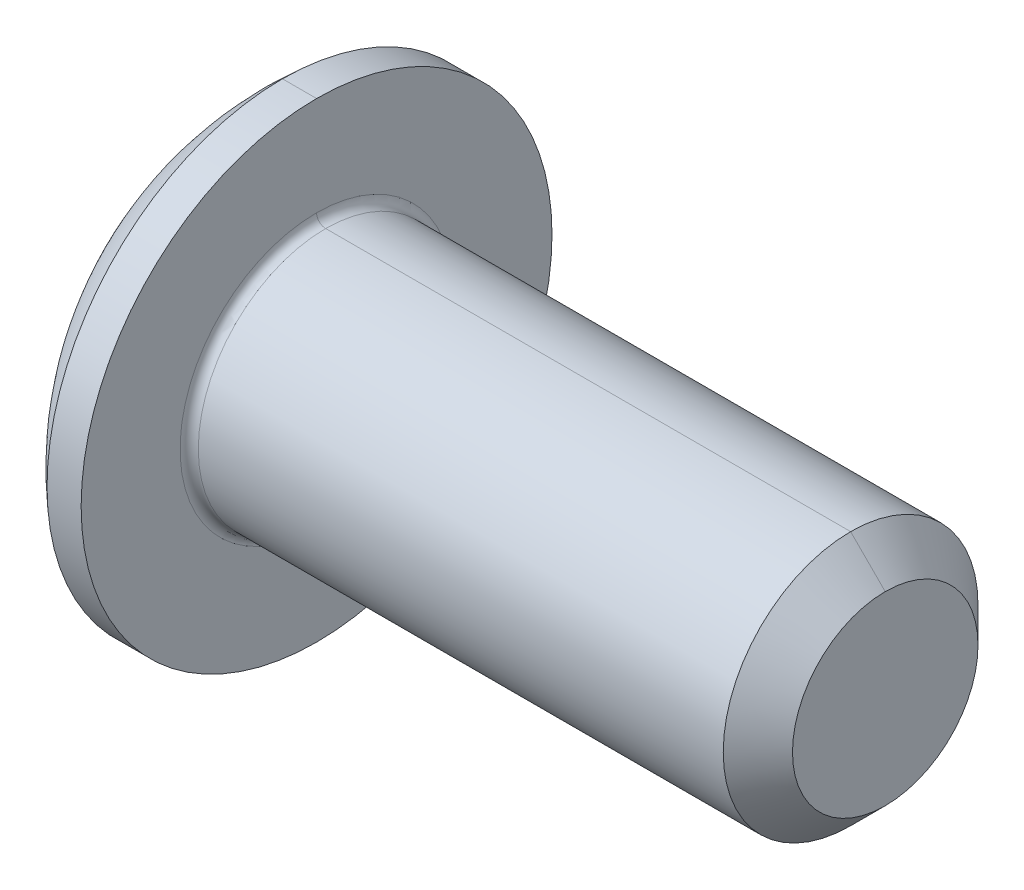
ISO-10303-21;
HEADER;
FILE_DESCRIPTION(('STEP AP214'),'2;1');
FILE_NAME('part.step','',(''),(''),'','','');
FILE_SCHEMA(('AUTOMOTIVE_DESIGN { 1 0 10303 214 1 1 1 1 }'));
ENDSEC;
DATA;
#1=APPLICATION_CONTEXT('core data for automotive mechanical design processes');
#2=APPLICATION_PROTOCOL_DEFINITION('international standard','automotive_design',2000,#1);
#3=PRODUCT_CONTEXT('',#1,'mechanical');
#4=PRODUCT('Part','Part','',(#3));
#5=PRODUCT_RELATED_PRODUCT_CATEGORY('part','',(#4));
#6=PRODUCT_DEFINITION_FORMATION('','',#4);
#7=PRODUCT_DEFINITION_CONTEXT('part definition',#1,'design');
#8=PRODUCT_DEFINITION('design','',#6,#7);
#9=PRODUCT_DEFINITION_SHAPE('','',#8);
#10=(LENGTH_UNIT() NAMED_UNIT(*) SI_UNIT(.MILLI.,.METRE.));
#11=(NAMED_UNIT(*) PLANE_ANGLE_UNIT() SI_UNIT($,.RADIAN.));
#12=(NAMED_UNIT(*) SI_UNIT($,.STERADIAN.) SOLID_ANGLE_UNIT());
#13=UNCERTAINTY_MEASURE_WITH_UNIT(LENGTH_MEASURE(1.E-05),#10,'distance_accuracy_value','');
#14=(GEOMETRIC_REPRESENTATION_CONTEXT(3) GLOBAL_UNCERTAINTY_ASSIGNED_CONTEXT((#13)) GLOBAL_UNIT_ASSIGNED_CONTEXT((#10,
#11,#12)) REPRESENTATION_CONTEXT('',''));
#15=CARTESIAN_POINT('',(0.,0.,0.));
#16=DIRECTION('',(0.,0.,1.));
#17=DIRECTION('',(1.,0.,0.));
#18=AXIS2_PLACEMENT_3D('',#15,#16,#17);
#19=CARTESIAN_POINT('',(-0.3175,0.,0.));
#20=DIRECTION('',(1.,0.,0.));
#21=DIRECTION('',(0.,-1.,0.));
#22=AXIS2_PLACEMENT_3D('',#19,#20,#21);
#23=CYLINDRICAL_SURFACE('',#22,1.4224);
#24=DIRECTION('',(1.,0.,0.));
#25=VECTOR('',#24,1.);
#26=CARTESIAN_POINT('',(0.1016,1.4224,0.));
#27=LINE('',#26,#25);
#28=CARTESIAN_POINT('',(0.1016,1.4224,0.));
#29=VERTEX_POINT('',#28);
#30=CARTESIAN_POINT('',(5.963333186975,1.4224,0.));
#31=VERTEX_POINT('',#30);
#32=EDGE_CURVE('E163',#29,#31,#27,.T.);
#33=ORIENTED_EDGE('',*,*,#32,.T.);
#34=CARTESIAN_POINT('',(5.963333186975,0.,0.));
#35=DIRECTION('',(-1.,0.,0.));
#36=DIRECTION('',(0.,1.,0.));
#37=AXIS2_PLACEMENT_3D('',#34,#35,#36);
#38=CIRCLE('',#37,1.4224);
#39=CARTESIAN_POINT('',(5.963333186975,-1.4224,0.));
#40=VERTEX_POINT('',#39);
#41=EDGE_CURVE('E134',#31,#40,#38,.T.);
#42=ORIENTED_EDGE('',*,*,#41,.T.);
#43=DIRECTION('',(1.,0.,0.));
#44=VECTOR('',#43,1.);
#45=CARTESIAN_POINT('',(0.1016,-1.4224,0.));
#46=LINE('',#45,#44);
#47=CARTESIAN_POINT('',(0.1016,-1.4224,0.));
#48=VERTEX_POINT('',#47);
#49=EDGE_CURVE('E23',#48,#40,#46,.T.);
#50=ORIENTED_EDGE('',*,*,#49,.F.);
#51=CARTESIAN_POINT('',(0.1016,0.,0.));
#52=DIRECTION('',(1.,0.,0.));
#53=DIRECTION('',(0.,-1.,0.));
#54=AXIS2_PLACEMENT_3D('',#51,#52,#53);
#55=CIRCLE('',#54,1.4224);
#56=EDGE_CURVE('E12',#48,#29,#55,.T.);
#57=ORIENTED_EDGE('',*,*,#56,.T.);
#58=EDGE_LOOP('',(#33,#42,#50,#57));
#59=FACE_BOUND('',#58,.T.);
#60=ADVANCED_FACE('F20',(#59),#23,.T.);
#61=CARTESIAN_POINT('',(0.1016,0.,0.));
#62=DIRECTION('',(1.,0.,0.));
#63=DIRECTION('',(0.,-1.,0.));
#64=AXIS2_PLACEMENT_3D('',#61,#62,#63);
#65=TOROIDAL_SURFACE('',#64,1.524,0.1016);
#66=CARTESIAN_POINT('',(0.1016,1.524,0.));
#67=DIRECTION('',(0.,0.,1.));
#68=DIRECTION('',(-1.,0.,0.));
#69=AXIS2_PLACEMENT_3D('',#66,#67,#68);
#70=CIRCLE('',#69,0.1016);
#71=CARTESIAN_POINT('',(0.,1.524,0.));
#72=VERTEX_POINT('',#71);
#73=EDGE_CURVE('E196',#72,#29,#70,.T.);
#74=ORIENTED_EDGE('',*,*,#73,.T.);
#75=ORIENTED_EDGE('',*,*,#56,.F.);
#76=CARTESIAN_POINT('',(0.1016,-1.524,0.));
#77=DIRECTION('',(0.,0.,-1.));
#78=DIRECTION('',(-1.,0.,0.));
#79=AXIS2_PLACEMENT_3D('',#76,#77,#78);
#80=CIRCLE('',#79,0.1016);
#81=CARTESIAN_POINT('',(0.,-1.524,0.));
#82=VERTEX_POINT('',#81);
#83=EDGE_CURVE('E200',#82,#48,#80,.T.);
#84=ORIENTED_EDGE('',*,*,#83,.F.);
#85=CARTESIAN_POINT('',(0.,0.,0.));
#86=DIRECTION('',(1.,0.,0.));
#87=DIRECTION('',(0.,-1.,0.));
#88=AXIS2_PLACEMENT_3D('',#85,#86,#87);
#89=CIRCLE('',#88,1.524);
#90=EDGE_CURVE('E228',#82,#72,#89,.T.);
#91=ORIENTED_EDGE('',*,*,#90,.T.);
#92=EDGE_LOOP('',(#74,#75,#84,#91));
#93=FACE_BOUND('',#92,.T.);
#94=ADVANCED_FACE('F354',(#93),#65,.F.);
#95=CARTESIAN_POINT('',(-1.397,0.454605601959952,-0.7874));
#96=DIRECTION('',(0.,-0.866025403784429,0.500000000000017));
#97=DIRECTION('',(0.,0.500000000000017,0.866025403784429));
#98=AXIS2_PLACEMENT_3D('',#95,#96,#97);
#99=PLANE('',#98);
#100=DIRECTION('',(-1.,0.,0.));
#101=VECTOR('',#100,1.);
#102=CARTESIAN_POINT('',(-0.508000244750286,0.909211203919889,0.));
#103=LINE('',#102,#101);
#104=CARTESIAN_POINT('',(-0.508000244750276,0.909211203919896,0.));
#105=VERTEX_POINT('',#104);
#106=CARTESIAN_POINT('',(-1.397,0.909211203919887,0.));
#107=VERTEX_POINT('',#106);
#108=EDGE_CURVE('E281',#105,#107,#103,.T.);
#109=ORIENTED_EDGE('',*,*,#108,.T.);
#110=DIRECTION('',(0.,-0.500000000000017,-0.866025403784429));
#111=VECTOR('',#110,1.);
#112=CARTESIAN_POINT('',(-1.397,0.909211203919884,0.));
#113=LINE('',#112,#111);
#114=CARTESIAN_POINT('',(-1.397,0.454605601959952,-0.7874));
#115=VERTEX_POINT('',#114);
#116=EDGE_CURVE('E326',#107,#115,#113,.T.);
#117=ORIENTED_EDGE('',*,*,#116,.T.);
#118=DIRECTION('',(-1.,0.,0.));
#119=VECTOR('',#118,1.);
#120=CARTESIAN_POINT('',(-0.508000244750286,0.454605601959952,-0.7874));
#121=LINE('',#120,#119);
#122=CARTESIAN_POINT('',(-0.508000244750277,0.454605601959955,-0.787400000000009));
#123=VERTEX_POINT('',#122);
#124=EDGE_CURVE('E30',#123,#115,#121,.T.);
#125=ORIENTED_EDGE('',*,*,#124,.F.);
#126=CARTESIAN_POINT('',(-2.08279926574925,0.681908402939897,-0.393700000000035));
#127=DIRECTION('',(0.,-0.866025403784429,0.500000000000017));
#128=DIRECTION('',(0.960768876886009,-0.13867512863452,-0.240192368541127));
#129=AXIS2_PLACEMENT_3D('',#126,#127,#128);
#130=CIRCLE('',#129,1.63910286738593);
#131=EDGE_CURVE('E267',#123,#105,#130,.T.);
#132=ORIENTED_EDGE('',*,*,#131,.T.);
#133=EDGE_LOOP('',(#109,#117,#125,#132));
#134=FACE_BOUND('',#133,.T.);
#135=ADVANCED_FACE('F346',(#134),#99,.T.);
#136=CARTESIAN_POINT('',(-1.397,-0.454605601959952,-0.7874));
#137=DIRECTION('',(0.,0.,1.));
#138=DIRECTION('',(0.,1.,0.));
#139=AXIS2_PLACEMENT_3D('',#136,#137,#138);
#140=PLANE('',#139);
#141=ORIENTED_EDGE('',*,*,#124,.T.);
#142=DIRECTION('',(0.,-1.,0.));
#143=VECTOR('',#142,1.);
#144=CARTESIAN_POINT('',(-1.397,0.454605601959952,-0.7874));
#145=LINE('',#144,#143);
#146=CARTESIAN_POINT('',(-1.397,-0.454605601959964,-0.787400000000003));
#147=VERTEX_POINT('',#146);
#148=EDGE_CURVE('E329',#115,#147,#145,.T.);
#149=ORIENTED_EDGE('',*,*,#148,.T.);
#150=DIRECTION('',(-1.,0.,0.));
#151=VECTOR('',#150,1.);
#152=CARTESIAN_POINT('',(-0.508000244750294,-0.454605601959952,-0.7874));
#153=LINE('',#152,#151);
#154=CARTESIAN_POINT('',(-0.508000244750276,-0.454605601959966,-0.787400000000008));
#155=VERTEX_POINT('',#154);
#156=EDGE_CURVE('E43',#155,#147,#153,.T.);
#157=ORIENTED_EDGE('',*,*,#156,.F.);
#158=CARTESIAN_POINT('',(-2.08279926574925,0.,-0.7874));
#159=DIRECTION('',(0.,0.,1.));
#160=DIRECTION('',(0.960768876885996,-0.277350257269074,0.));
#161=AXIS2_PLACEMENT_3D('',#158,#159,#160);
#162=CIRCLE('',#161,1.63910286738595);
#163=EDGE_CURVE('E264',#155,#123,#162,.T.);
#164=ORIENTED_EDGE('',*,*,#163,.T.);
#165=EDGE_LOOP('',(#141,#149,#157,#164));
#166=FACE_BOUND('',#165,.T.);
#167=ADVANCED_FACE('F344',(#166),#140,.T.);
#168=CARTESIAN_POINT('',(-2.08279926574925,0.,0.));
#169=DIRECTION('',(1.,0.,0.));
#170=DIRECTION('',(0.,-1.,0.));
#171=AXIS2_PLACEMENT_3D('',#168,#169,#170);
#172=SPHERICAL_SURFACE('',#171,1.81842156);
#173=CARTESIAN_POINT('',(-2.08279926574925,0.,0.));
#174=DIRECTION('',(0.,0.,1.));
#175=DIRECTION('',(0.866025269189491,-0.500000233125215,0.));
#176=AXIS2_PLACEMENT_3D('',#173,#174,#175);
#177=CIRCLE('',#176,1.81842156);
#178=CARTESIAN_POINT('',(-0.508000244750272,-0.909211203919897,0.));
#179=VERTEX_POINT('',#178);
#180=CARTESIAN_POINT('',(-0.264377705749246,0.,0.));
#181=VERTEX_POINT('',#180);
#182=EDGE_CURVE('E272',#179,#181,#177,.T.);
#183=ORIENTED_EDGE('',*,*,#182,.T.);
#184=CARTESIAN_POINT('',(-2.08279926574925,0.,0.));
#185=DIRECTION('',(0.,0.,-1.));
#186=DIRECTION('',(0.866025269189494,0.50000023312521,0.));
#187=AXIS2_PLACEMENT_3D('',#184,#185,#186);
#188=CIRCLE('',#187,1.81842156);
#189=EDGE_CURVE('E260',#105,#181,#188,.T.);
#190=ORIENTED_EDGE('',*,*,#189,.F.);
#191=ORIENTED_EDGE('',*,*,#131,.F.);
#192=ORIENTED_EDGE('',*,*,#163,.F.);
#193=CARTESIAN_POINT('',(-2.08279926574925,-0.681908402939913,-0.393700000000044));
#194=DIRECTION('',(0.,0.866025403784429,0.500000000000017));
#195=DIRECTION('',(0.960768876885994,-0.138675128634545,0.240192368541171));
#196=AXIS2_PLACEMENT_3D('',#193,#194,#195);
#197=CIRCLE('',#196,1.63910286738592);
#198=EDGE_CURVE('E259',#179,#155,#197,.T.);
#199=ORIENTED_EDGE('',*,*,#198,.F.);
#200=EDGE_LOOP('',(#183,#190,#191,#192,#199));
#201=FACE_BOUND('',#200,.T.);
#202=ADVANCED_FACE('F342',(#201),#172,.F.);
#203=CARTESIAN_POINT('',(-1.397,-0.909211203919904,0.));
#204=DIRECTION('',(0.,0.866025403784429,0.500000000000017));
#205=DIRECTION('',(0.,0.500000000000017,-0.866025403784429));
#206=AXIS2_PLACEMENT_3D('',#203,#204,#205);
#207=PLANE('',#206);
#208=ORIENTED_EDGE('',*,*,#156,.T.);
#209=DIRECTION('',(0.,-0.500000000000017,0.866025403784429));
#210=VECTOR('',#209,1.);
#211=CARTESIAN_POINT('',(-1.397,-0.454605601959972,-0.7874));
#212=LINE('',#211,#210);
#213=CARTESIAN_POINT('',(-1.397,-0.909211203919904,0.));
#214=VERTEX_POINT('',#213);
#215=EDGE_CURVE('E333',#147,#214,#212,.T.);
#216=ORIENTED_EDGE('',*,*,#215,.T.);
#217=DIRECTION('',(-1.,0.,0.));
#218=VECTOR('',#217,1.);
#219=CARTESIAN_POINT('',(-0.508000244750286,-0.909211203919904,0.));
#220=LINE('',#219,#218);
#221=EDGE_CURVE('E255',#179,#214,#220,.T.);
#222=ORIENTED_EDGE('',*,*,#221,.F.);
#223=ORIENTED_EDGE('',*,*,#198,.T.);
#224=EDGE_LOOP('',(#208,#216,#222,#223));
#225=FACE_BOUND('',#224,.T.);
#226=ADVANCED_FACE('F340',(#225),#207,.T.);
#227=CARTESIAN_POINT('',(-1.397,-0.909211203919904,0.));
#228=DIRECTION('',(0.,0.866025403784429,-0.500000000000017));
#229=DIRECTION('',(0.,0.500000000000017,0.866025403784429));
#230=AXIS2_PLACEMENT_3D('',#227,#228,#229);
#231=PLANE('',#230);
#232=DIRECTION('',(-1.,0.,0.));
#233=VECTOR('',#232,1.);
#234=CARTESIAN_POINT('',(-0.508000244750286,-0.454605601959967,0.787400000000009));
#235=LINE('',#234,#233);
#236=CARTESIAN_POINT('',(-0.508000244750277,-0.45460560195996,0.787400000000012));
#237=VERTEX_POINT('',#236);
#238=CARTESIAN_POINT('',(-1.397,-0.454605601959964,0.787400000000003));
#239=VERTEX_POINT('',#238);
#240=EDGE_CURVE('E245',#237,#239,#235,.T.);
#241=ORIENTED_EDGE('',*,*,#240,.F.);
#242=CARTESIAN_POINT('',(-2.08279926574925,-0.681908402939913,0.393700000000044));
#243=DIRECTION('',(0.,0.866025403784429,-0.500000000000017));
#244=DIRECTION('',(0.960768876886009,0.13867512863452,0.240192368541127));
#245=AXIS2_PLACEMENT_3D('',#242,#243,#244);
#246=CIRCLE('',#245,1.63910286738592);
#247=EDGE_CURVE('E251',#237,#179,#246,.T.);
#248=ORIENTED_EDGE('',*,*,#247,.T.);
#249=ORIENTED_EDGE('',*,*,#221,.T.);
#250=DIRECTION('',(0.,0.500000000000017,0.866025403784429));
#251=VECTOR('',#250,1.);
#252=CARTESIAN_POINT('',(-1.397,-0.909211203919904,0.));
#253=LINE('',#252,#251);
#254=EDGE_CURVE('E287',#214,#239,#253,.T.);
#255=ORIENTED_EDGE('',*,*,#254,.T.);
#256=EDGE_LOOP('',(#241,#248,#249,#255));
#257=FACE_BOUND('',#256,.T.);
#258=ADVANCED_FACE('F339',(#257),#231,.T.);
#259=CARTESIAN_POINT('',(-2.08279926574925,0.,0.));
#260=DIRECTION('',(1.,0.,0.));
#261=DIRECTION('',(0.,-1.,0.));
#262=AXIS2_PLACEMENT_3D('',#259,#260,#261);
#263=SPHERICAL_SURFACE('',#262,1.81842156);
#264=CARTESIAN_POINT('',(-2.08279926574925,0.,0.7874));
#265=DIRECTION('',(0.,0.,-1.));
#266=DIRECTION('',(0.960768876885996,0.277350257269074,0.));
#267=AXIS2_PLACEMENT_3D('',#264,#265,#266);
#268=CIRCLE('',#267,1.63910286738595);
#269=CARTESIAN_POINT('',(-0.508000244750276,0.454605601959961,0.787400000000005));
#270=VERTEX_POINT('',#269);
#271=EDGE_CURVE('E252',#270,#237,#268,.T.);
#272=ORIENTED_EDGE('',*,*,#271,.F.);
#273=CARTESIAN_POINT('',(-2.08279926574925,0.681908402939897,0.393700000000035));
#274=DIRECTION('',(0.,-0.866025403784429,-0.500000000000017));
#275=DIRECTION('',(0.960768876885994,0.138675128634545,-0.240192368541171));
#276=AXIS2_PLACEMENT_3D('',#273,#274,#275);
#277=CIRCLE('',#276,1.63910286738593);
#278=EDGE_CURVE('E286',#105,#270,#277,.T.);
#279=ORIENTED_EDGE('',*,*,#278,.F.);
#280=ORIENTED_EDGE('',*,*,#189,.T.);
#281=ORIENTED_EDGE('',*,*,#182,.F.);
#282=ORIENTED_EDGE('',*,*,#247,.F.);
#283=EDGE_LOOP('',(#272,#279,#280,#281,#282));
#284=FACE_BOUND('',#283,.T.);
#285=ADVANCED_FACE('F311',(#284),#263,.F.);
#286=CARTESIAN_POINT('',(-1.397,-0.454605601959952,0.7874));
#287=DIRECTION('',(0.,0.,-1.));
#288=DIRECTION('',(0.,1.,0.));
#289=AXIS2_PLACEMENT_3D('',#286,#287,#288);
#290=PLANE('',#289);
#291=ORIENTED_EDGE('',*,*,#240,.T.);
#292=DIRECTION('',(0.,-1.,0.));
#293=VECTOR('',#292,1.);
#294=CARTESIAN_POINT('',(-1.397,0.454605601959952,0.7874));
#295=LINE('',#294,#293);
#296=CARTESIAN_POINT('',(-1.397,0.454605601959952,0.7874));
#297=VERTEX_POINT('',#296);
#298=EDGE_CURVE('E293',#297,#239,#295,.T.);
#299=ORIENTED_EDGE('',*,*,#298,.F.);
#300=DIRECTION('',(-1.,0.,0.));
#301=VECTOR('',#300,1.);
#302=CARTESIAN_POINT('',(-0.508000244750294,0.454605601959952,0.7874));
#303=LINE('',#302,#301);
#304=EDGE_CURVE('E289',#270,#297,#303,.T.);
#305=ORIENTED_EDGE('',*,*,#304,.F.);
#306=ORIENTED_EDGE('',*,*,#271,.T.);
#307=EDGE_LOOP('',(#291,#299,#305,#306));
#308=FACE_BOUND('',#307,.T.);
#309=ADVANCED_FACE('F318',(#308),#290,.T.);
#310=CARTESIAN_POINT('',(-1.397,0.454605601959952,0.7874));
#311=DIRECTION('',(0.,-0.866025403784429,-0.500000000000017));
#312=DIRECTION('',(0.,0.500000000000017,-0.866025403784429));
#313=AXIS2_PLACEMENT_3D('',#310,#311,#312);
#314=PLANE('',#313);
#315=ORIENTED_EDGE('',*,*,#108,.F.);
#316=ORIENTED_EDGE('',*,*,#278,.T.);
#317=ORIENTED_EDGE('',*,*,#304,.T.);
#318=DIRECTION('',(0.,0.500000000000017,-0.866025403784429));
#319=VECTOR('',#318,1.);
#320=CARTESIAN_POINT('',(-1.397,0.454605601959952,0.7874));
#321=LINE('',#320,#319);
#322=EDGE_CURVE('E187',#297,#107,#321,.T.);
#323=ORIENTED_EDGE('',*,*,#322,.T.);
#324=EDGE_LOOP('',(#315,#316,#317,#323));
#325=FACE_BOUND('',#324,.T.);
#326=ADVANCED_FACE('F306',(#325),#314,.T.);
#327=CARTESIAN_POINT('',(-1.397,0.,0.));
#328=DIRECTION('',(1.,0.,0.));
#329=DIRECTION('',(0.,-1.,0.));
#330=AXIS2_PLACEMENT_3D('',#327,#328,#329);
#331=PLANE('',#330);
#332=ORIENTED_EDGE('',*,*,#298,.T.);
#333=ORIENTED_EDGE('',*,*,#254,.F.);
#334=ORIENTED_EDGE('',*,*,#215,.F.);
#335=ORIENTED_EDGE('',*,*,#148,.F.);
#336=ORIENTED_EDGE('',*,*,#116,.F.);
#337=ORIENTED_EDGE('',*,*,#322,.F.);
#338=EDGE_LOOP('',(#332,#333,#334,#335,#336,#337));
#339=FACE_BOUND('',#338,.T.);
#340=CARTESIAN_POINT('',(-1.397,0.,0.));
#341=DIRECTION('',(1.,0.,0.));
#342=DIRECTION('',(0.,1.,0.));
#343=AXIS2_PLACEMENT_3D('',#340,#341,#342);
#344=CIRCLE('',#343,1.1241719325032);
#345=CARTESIAN_POINT('',(-1.39700000000065,1.12417193250022,0.));
#346=VERTEX_POINT('',#345);
#347=CARTESIAN_POINT('',(-1.39700000000065,-1.12417193250022,0.));
#348=VERTEX_POINT('',#347);
#349=EDGE_CURVE('E188',#346,#348,#344,.T.);
#350=ORIENTED_EDGE('',*,*,#349,.F.);
#351=CARTESIAN_POINT('',(-1.397,0.,0.));
#352=DIRECTION('',(1.,0.,0.));
#353=DIRECTION('',(0.,-1.,0.));
#354=AXIS2_PLACEMENT_3D('',#351,#352,#353);
#355=CIRCLE('',#354,1.1241719325032);
#356=EDGE_CURVE('E182',#348,#346,#355,.T.);
#357=ORIENTED_EDGE('',*,*,#356,.F.);
#358=EDGE_LOOP('',(#350,#357));
#359=FACE_BOUND('',#358,.T.);
#360=ADVANCED_FACE('F321',(#339,#359),#331,.F.);
#361=CARTESIAN_POINT('',(1.89020899418278,0.,0.));
#362=DIRECTION('',(-0.94619920312116,-0.323584715357325,0.));
#363=DIRECTION('',(-0.323584715357325,0.94619920312116,0.));
#364=AXIS2_PLACEMENT_3D('',#361,#362,#363);
#365=SPHERICAL_SURFACE('',#364,3.4741193855802);
#366=CARTESIAN_POINT('',(-0.380999999999999,0.,0.));
#367=DIRECTION('',(1.,0.,0.));
#368=DIRECTION('',(0.,-1.,0.));
#369=AXIS2_PLACEMENT_3D('',#366,#367,#368);
#370=CIRCLE('',#369,2.6289);
#371=CARTESIAN_POINT('',(-0.381000000000347,-2.6289000000004,0.));
#372=VERTEX_POINT('',#371);
#373=CARTESIAN_POINT('',(-0.381000000000347,2.6289000000004,0.));
#374=VERTEX_POINT('',#373);
#375=EDGE_CURVE('E171',#372,#374,#370,.T.);
#376=ORIENTED_EDGE('',*,*,#375,.F.);
#377=CARTESIAN_POINT('',(1.89020899418278,0.,0.));
#378=DIRECTION('',(0.,0.,1.));
#379=DIRECTION('',(-0.94619920312116,-0.323584715357325,0.));
#380=AXIS2_PLACEMENT_3D('',#377,#378,#379);
#381=CIRCLE('',#380,3.4741193855802);
#382=EDGE_CURVE('E179',#348,#372,#381,.T.);
#383=ORIENTED_EDGE('',*,*,#382,.F.);
#384=ORIENTED_EDGE('',*,*,#356,.T.);
#385=CARTESIAN_POINT('',(1.89020899418278,0.,0.));
#386=DIRECTION('',(0.,0.,-1.));
#387=DIRECTION('',(-0.94619920312116,0.323584715357325,0.));
#388=AXIS2_PLACEMENT_3D('',#385,#386,#387);
#389=CIRCLE('',#388,3.4741193855802);
#390=EDGE_CURVE('E222',#346,#374,#389,.T.);
#391=ORIENTED_EDGE('',*,*,#390,.T.);
#392=EDGE_LOOP('',(#376,#383,#384,#391));
#393=FACE_BOUND('',#392,.T.);
#394=ADVANCED_FACE('F395',(#393),#365,.T.);
#395=CARTESIAN_POINT('',(1.89020899418278,0.,0.));
#396=DIRECTION('',(1.,0.,0.));
#397=DIRECTION('',(0.,-1.,0.));
#398=AXIS2_PLACEMENT_3D('',#395,#396,#397);
#399=SPHERICAL_SURFACE('',#398,3.4741193855802);
#400=ORIENTED_EDGE('',*,*,#349,.T.);
#401=ORIENTED_EDGE('',*,*,#382,.T.);
#402=CARTESIAN_POINT('',(-0.381000000000694,0.,0.));
#403=DIRECTION('',(1.,0.,0.));
#404=DIRECTION('',(0.,1.,0.));
#405=AXIS2_PLACEMENT_3D('',#402,#403,#404);
#406=CIRCLE('',#405,2.6289000000008);
#407=EDGE_CURVE('E217',#374,#372,#406,.T.);
#408=ORIENTED_EDGE('',*,*,#407,.F.);
#409=ORIENTED_EDGE('',*,*,#390,.F.);
#410=EDGE_LOOP('',(#400,#401,#408,#409));
#411=FACE_BOUND('',#410,.T.);
#412=ADVANCED_FACE('F391',(#411),#399,.T.);
#413=CARTESIAN_POINT('',(-1.46685,0.,0.));
#414=DIRECTION('',(1.,0.,0.));
#415=DIRECTION('',(0.,-1.,0.));
#416=AXIS2_PLACEMENT_3D('',#413,#414,#415);
#417=CYLINDRICAL_SURFACE('',#416,2.6289);
#418=ORIENTED_EDGE('',*,*,#407,.T.);
#419=DIRECTION('',(1.,0.,0.));
#420=VECTOR('',#419,1.);
#421=CARTESIAN_POINT('',(-0.381,-2.6289,0.));
#422=LINE('',#421,#420);
#423=CARTESIAN_POINT('',(0.,-2.6289,0.));
#424=VERTEX_POINT('',#423);
#425=EDGE_CURVE('E177',#372,#424,#422,.T.);
#426=ORIENTED_EDGE('',*,*,#425,.T.);
#427=CARTESIAN_POINT('',(0.,0.,0.));
#428=DIRECTION('',(-1.,0.,0.));
#429=DIRECTION('',(0.,-1.,0.));
#430=AXIS2_PLACEMENT_3D('',#427,#428,#429);
#431=CIRCLE('',#430,2.6289);
#432=CARTESIAN_POINT('',(0.,2.6289,0.));
#433=VERTEX_POINT('',#432);
#434=EDGE_CURVE('E211',#424,#433,#431,.T.);
#435=ORIENTED_EDGE('',*,*,#434,.T.);
#436=DIRECTION('',(1.,0.,0.));
#437=VECTOR('',#436,1.);
#438=CARTESIAN_POINT('',(-0.381,2.6289,0.));
#439=LINE('',#438,#437);
#440=EDGE_CURVE('E178',#374,#433,#439,.T.);
#441=ORIENTED_EDGE('',*,*,#440,.F.);
#442=EDGE_LOOP('',(#418,#426,#435,#441));
#443=FACE_BOUND('',#442,.T.);
#444=ADVANCED_FACE('F403',(#443),#417,.T.);
#445=CARTESIAN_POINT('',(-1.46685,0.,0.));
#446=DIRECTION('',(1.,0.,0.));
#447=DIRECTION('',(0.,-1.,0.));
#448=AXIS2_PLACEMENT_3D('',#445,#446,#447);
#449=CYLINDRICAL_SURFACE('',#448,2.6289);
#450=CARTESIAN_POINT('',(0.,0.,0.));
#451=DIRECTION('',(-1.,0.,0.));
#452=DIRECTION('',(0.,1.,0.));
#453=AXIS2_PLACEMENT_3D('',#450,#451,#452);
#454=CIRCLE('',#453,2.6289);
#455=EDGE_CURVE('E206',#433,#424,#454,.T.);
#456=ORIENTED_EDGE('',*,*,#455,.T.);
#457=ORIENTED_EDGE('',*,*,#425,.F.);
#458=ORIENTED_EDGE('',*,*,#375,.T.);
#459=ORIENTED_EDGE('',*,*,#440,.T.);
#460=EDGE_LOOP('',(#456,#457,#458,#459));
#461=FACE_BOUND('',#460,.T.);
#462=ADVANCED_FACE('F398',(#461),#449,.T.);
#463=CARTESIAN_POINT('',(0.,0.,0.));
#464=DIRECTION('',(1.,0.,0.));
#465=DIRECTION('',(0.,-1.,0.));
#466=AXIS2_PLACEMENT_3D('',#463,#464,#465);
#467=PLANE('',#466);
#468=ORIENTED_EDGE('',*,*,#90,.F.);
#469=CARTESIAN_POINT('',(0.,0.,0.));
#470=DIRECTION('',(1.,0.,0.));
#471=DIRECTION('',(0.,1.,0.));
#472=AXIS2_PLACEMENT_3D('',#469,#470,#471);
#473=CIRCLE('',#472,1.524);
#474=EDGE_CURVE('E201',#72,#82,#473,.T.);
#475=ORIENTED_EDGE('',*,*,#474,.F.);
#476=EDGE_LOOP('',(#468,#475));
#477=FACE_BOUND('',#476,.T.);
#478=ORIENTED_EDGE('',*,*,#434,.F.);
#479=ORIENTED_EDGE('',*,*,#455,.F.);
#480=EDGE_LOOP('',(#478,#479));
#481=FACE_BOUND('',#480,.T.);
#482=ADVANCED_FACE('F379',(#477,#481),#467,.T.);
#483=CARTESIAN_POINT('',(0.1016,0.,0.));
#484=DIRECTION('',(1.,0.,0.));
#485=DIRECTION('',(0.,-1.,0.));
#486=AXIS2_PLACEMENT_3D('',#483,#484,#485);
#487=TOROIDAL_SURFACE('',#486,1.524,0.1016);
#488=ORIENTED_EDGE('',*,*,#83,.T.);
#489=CARTESIAN_POINT('',(0.1016,0.,0.));
#490=DIRECTION('',(1.,0.,0.));
#491=DIRECTION('',(0.,1.,0.));
#492=AXIS2_PLACEMENT_3D('',#489,#490,#491);
#493=CIRCLE('',#492,1.4224);
#494=EDGE_CURVE('E162',#29,#48,#493,.T.);
#495=ORIENTED_EDGE('',*,*,#494,.F.);
#496=ORIENTED_EDGE('',*,*,#73,.F.);
#497=ORIENTED_EDGE('',*,*,#474,.T.);
#498=EDGE_LOOP('',(#488,#495,#496,#497));
#499=FACE_BOUND('',#498,.T.);
#500=ADVANCED_FACE('F376',(#499),#487,.F.);
#501=CARTESIAN_POINT('',(-0.3175,0.,0.));
#502=DIRECTION('',(1.,0.,0.));
#503=DIRECTION('',(0.,-1.,0.));
#504=AXIS2_PLACEMENT_3D('',#501,#502,#503);
#505=CYLINDRICAL_SURFACE('',#504,1.4224);
#506=ORIENTED_EDGE('',*,*,#49,.T.);
#507=CARTESIAN_POINT('',(5.963333186975,0.,0.));
#508=DIRECTION('',(-1.,0.,0.));
#509=DIRECTION('',(0.,-1.,0.));
#510=AXIS2_PLACEMENT_3D('',#507,#508,#509);
#511=CIRCLE('',#510,1.4224);
#512=EDGE_CURVE('E154',#40,#31,#511,.T.);
#513=ORIENTED_EDGE('',*,*,#512,.T.);
#514=ORIENTED_EDGE('',*,*,#32,.F.);
#515=ORIENTED_EDGE('',*,*,#494,.T.);
#516=EDGE_LOOP('',(#506,#513,#514,#515));
#517=FACE_BOUND('',#516,.T.);
#518=ADVANCED_FACE('F367',(#517),#505,.T.);
#519=CARTESIAN_POINT('',(6.3598369158658,0.,0.));
#520=DIRECTION('',(-1.,0.,0.));
#521=DIRECTION('',(0.,1.,0.));
#522=AXIS2_PLACEMENT_3D('',#519,#520,#521);
#523=CONICAL_SURFACE('',#522,1.0258962711092,0.785398163397448);
#524=ORIENTED_EDGE('',*,*,#512,.F.);
#525=DIRECTION('',(0.707106781186548,0.707106781186547,0.));
#526=VECTOR('',#525,1.);
#527=CARTESIAN_POINT('',(5.963333186975,-1.4224,0.));
#528=LINE('',#527,#526);
#529=CARTESIAN_POINT('',(6.35,-1.035733186975,0.));
#530=VERTEX_POINT('',#529);
#531=EDGE_CURVE('E125',#40,#530,#528,.T.);
#532=ORIENTED_EDGE('',*,*,#531,.T.);
#533=CARTESIAN_POINT('',(6.35,0.,0.));
#534=DIRECTION('',(-1.,0.,0.));
#535=DIRECTION('',(0.,-1.,0.));
#536=AXIS2_PLACEMENT_3D('',#533,#534,#535);
#537=CIRCLE('',#536,1.035733186975);
#538=CARTESIAN_POINT('',(6.35,1.035733186975,0.));
#539=VERTEX_POINT('',#538);
#540=EDGE_CURVE('E118',#530,#539,#537,.T.);
#541=ORIENTED_EDGE('',*,*,#540,.T.);
#542=DIRECTION('',(0.707106781186548,-0.707106781186547,0.));
#543=VECTOR('',#542,1.);
#544=CARTESIAN_POINT('',(5.963333186975,1.4224,0.));
#545=LINE('',#544,#543);
#546=EDGE_CURVE('E122',#31,#539,#545,.T.);
#547=ORIENTED_EDGE('',*,*,#546,.F.);
#548=EDGE_LOOP('',(#524,#532,#541,#547));
#549=FACE_BOUND('',#548,.T.);
#550=ADVANCED_FACE('F121',(#549),#523,.T.);
#551=CARTESIAN_POINT('',(6.3598369158658,0.,0.));
#552=DIRECTION('',(-1.,0.,0.));
#553=DIRECTION('',(0.,1.,0.));
#554=AXIS2_PLACEMENT_3D('',#551,#552,#553);
#555=CONICAL_SURFACE('',#554,1.0258962711092,0.785398163397448);
#556=CARTESIAN_POINT('',(6.35,0.,0.));
#557=DIRECTION('',(-1.,0.,0.));
#558=DIRECTION('',(0.,1.,0.));
#559=AXIS2_PLACEMENT_3D('',#556,#557,#558);
#560=CIRCLE('',#559,1.035733186975);
#561=EDGE_CURVE('E130',#539,#530,#560,.T.);
#562=ORIENTED_EDGE('',*,*,#561,.T.);
#563=ORIENTED_EDGE('',*,*,#531,.F.);
#564=ORIENTED_EDGE('',*,*,#41,.F.);
#565=ORIENTED_EDGE('',*,*,#546,.T.);
#566=EDGE_LOOP('',(#562,#563,#564,#565));
#567=FACE_BOUND('',#566,.T.);
#568=ADVANCED_FACE('F133',(#567),#555,.T.);
#569=CARTESIAN_POINT('',(6.35,0.,0.));
#570=DIRECTION('',(1.,0.,0.));
#571=DIRECTION('',(0.,-1.,0.));
#572=AXIS2_PLACEMENT_3D('',#569,#570,#571);
#573=PLANE('',#572);
#574=ORIENTED_EDGE('',*,*,#540,.F.);
#575=ORIENTED_EDGE('',*,*,#561,.F.);
#576=EDGE_LOOP('',(#574,#575));
#577=FACE_BOUND('',#576,.T.);
#578=ADVANCED_FACE('F136',(#577),#573,.T.);
#579=CLOSED_SHELL('',(#60,#94,#135,#167,#202,#226,#258,#285,#309,#326,#360,#394,#412,#444,#462,
#482,#500,#518,#550,#568,#578));
#580=MANIFOLD_SOLID_BREP('B1',#579);
#581=ADVANCED_BREP_SHAPE_REPRESENTATION('',(#18,#580),#14);
#582=SHAPE_DEFINITION_REPRESENTATION(#9,#581);
ENDSEC;
END-ISO-10303-21;
